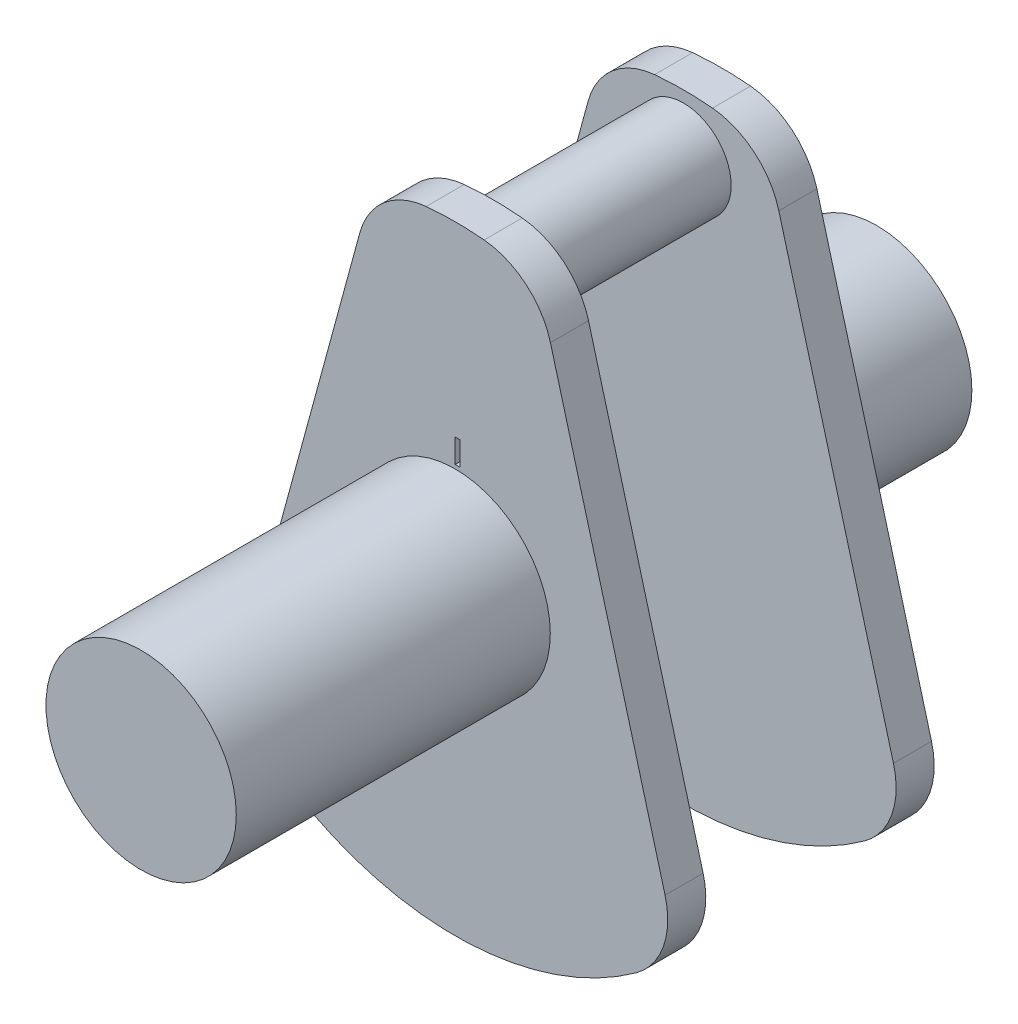
ISO-10303-21;
HEADER;
FILE_DESCRIPTION(('STEP AP214'),'2;1');
FILE_NAME('part.step','',(''),(''),'','','');
FILE_SCHEMA(('AUTOMOTIVE_DESIGN { 1 0 10303 214 1 1 1 1 }'));
ENDSEC;
DATA;
#1=APPLICATION_CONTEXT('core data for automotive mechanical design processes');
#2=APPLICATION_PROTOCOL_DEFINITION('international standard','automotive_design',2000,#1);
#3=PRODUCT_CONTEXT('',#1,'mechanical');
#4=PRODUCT('Part','Part','',(#3));
#5=PRODUCT_RELATED_PRODUCT_CATEGORY('part','',(#4));
#6=PRODUCT_DEFINITION_FORMATION('','',#4);
#7=PRODUCT_DEFINITION_CONTEXT('part definition',#1,'design');
#8=PRODUCT_DEFINITION('design','',#6,#7);
#9=PRODUCT_DEFINITION_SHAPE('','',#8);
#10=(LENGTH_UNIT() NAMED_UNIT(*) SI_UNIT(.MILLI.,.METRE.));
#11=(NAMED_UNIT(*) PLANE_ANGLE_UNIT() SI_UNIT($,.RADIAN.));
#12=(NAMED_UNIT(*) SI_UNIT($,.STERADIAN.) SOLID_ANGLE_UNIT());
#13=UNCERTAINTY_MEASURE_WITH_UNIT(LENGTH_MEASURE(1.E-05),#10,'distance_accuracy_value','');
#14=(GEOMETRIC_REPRESENTATION_CONTEXT(3) GLOBAL_UNCERTAINTY_ASSIGNED_CONTEXT((#13)) GLOBAL_UNIT_ASSIGNED_CONTEXT((#10,
#11,#12)) REPRESENTATION_CONTEXT('',''));
#15=CARTESIAN_POINT('',(0.,0.,0.));
#16=DIRECTION('',(0.,0.,1.));
#17=DIRECTION('',(1.,0.,0.));
#18=AXIS2_PLACEMENT_3D('',#15,#16,#17);
#19=CARTESIAN_POINT('',(0.459,4.87845457086565,0.8));
#20=DIRECTION('',(0.,0.,-1.));
#21=DIRECTION('',(-1.,0.,0.));
#22=AXIS2_PLACEMENT_3D('',#19,#20,#21);
#23=CYLINDRICAL_SURFACE('',#22,1.6);
#24=CARTESIAN_POINT('',(0.459,4.87845457086565,0.));
#25=DIRECTION('',(0.,0.,1.));
#26=DIRECTION('',(1.,0.,0.));
#27=AXIS2_PLACEMENT_3D('',#24,#25,#26);
#28=CIRCLE('',#27,1.6);
#29=CARTESIAN_POINT('',(2.00284320160388,5.29863092534255,0.));
#30=VERTEX_POINT('',#29);
#31=CARTESIAN_POINT('',(0.608877551020407,6.47141932869934,0.));
#32=VERTEX_POINT('',#31);
#33=EDGE_CURVE('E148',#30,#32,#28,.T.);
#34=ORIENTED_EDGE('',*,*,#33,.T.);
#35=DIRECTION('',(0.,0.,-1.));
#36=VECTOR('',#35,1.);
#37=CARTESIAN_POINT('',(0.608877551020407,6.47141932869934,0.8));
#38=LINE('',#37,#36);
#39=CARTESIAN_POINT('',(0.608877551020407,6.47141932869934,0.8));
#40=VERTEX_POINT('',#39);
#41=EDGE_CURVE('E46',#40,#32,#38,.T.);
#42=ORIENTED_EDGE('',*,*,#41,.F.);
#43=CARTESIAN_POINT('',(0.459,4.87845457086565,0.8));
#44=DIRECTION('',(0.,0.,1.));
#45=DIRECTION('',(1.,0.,0.));
#46=AXIS2_PLACEMENT_3D('',#43,#44,#45);
#47=CIRCLE('',#46,1.6);
#48=CARTESIAN_POINT('',(2.00284320160388,5.29863092534255,0.8));
#49=VERTEX_POINT('',#48);
#50=EDGE_CURVE('E164',#49,#40,#47,.T.);
#51=ORIENTED_EDGE('',*,*,#50,.F.);
#52=DIRECTION('',(0.,0.,-1.));
#53=VECTOR('',#52,1.);
#54=CARTESIAN_POINT('',(2.00284320160388,5.29863092534255,0.8));
#55=LINE('',#54,#53);
#56=EDGE_CURVE('E144',#49,#30,#55,.T.);
#57=ORIENTED_EDGE('',*,*,#56,.T.);
#58=EDGE_LOOP('',(#34,#42,#51,#57));
#59=FACE_BOUND('',#58,.T.);
#60=ADVANCED_FACE('F39',(#59),#23,.T.);
#61=CARTESIAN_POINT('',(0.,0.,0.8));
#62=DIRECTION('',(0.,0.,-1.));
#63=DIRECTION('',(-1.,0.,0.));
#64=AXIS2_PLACEMENT_3D('',#61,#62,#63);
#65=CYLINDRICAL_SURFACE('',#64,6.5);
#66=CARTESIAN_POINT('',(0.,0.,0.));
#67=DIRECTION('',(0.,0.,1.));
#68=DIRECTION('',(1.,0.,0.));
#69=AXIS2_PLACEMENT_3D('',#66,#67,#68);
#70=CIRCLE('',#69,6.5);
#71=CARTESIAN_POINT('',(-0.608877551020408,6.47141932869934,0.));
#72=VERTEX_POINT('',#71);
#73=EDGE_CURVE('E151',#32,#72,#70,.T.);
#74=ORIENTED_EDGE('',*,*,#73,.T.);
#75=DIRECTION('',(0.,0.,-1.));
#76=VECTOR('',#75,1.);
#77=CARTESIAN_POINT('',(-0.608877551020408,6.47141932869934,0.8));
#78=LINE('',#77,#76);
#79=CARTESIAN_POINT('',(-0.608877551020408,6.47141932869934,0.8));
#80=VERTEX_POINT('',#79);
#81=EDGE_CURVE('E174',#80,#72,#78,.T.);
#82=ORIENTED_EDGE('',*,*,#81,.F.);
#83=CARTESIAN_POINT('',(0.,0.,0.8));
#84=DIRECTION('',(0.,0.,1.));
#85=DIRECTION('',(1.,0.,0.));
#86=AXIS2_PLACEMENT_3D('',#83,#84,#85);
#87=CIRCLE('',#86,6.5);
#88=EDGE_CURVE('E104',#40,#80,#87,.T.);
#89=ORIENTED_EDGE('',*,*,#88,.F.);
#90=ORIENTED_EDGE('',*,*,#41,.T.);
#91=EDGE_LOOP('',(#74,#82,#89,#90));
#92=FACE_BOUND('',#91,.T.);
#93=ADVANCED_FACE('F177',(#92),#65,.T.);
#94=CARTESIAN_POINT('',(-0.459,4.87845457086565,0.8));
#95=DIRECTION('',(0.,0.,-1.));
#96=DIRECTION('',(-1.,0.,0.));
#97=AXIS2_PLACEMENT_3D('',#94,#95,#96);
#98=CYLINDRICAL_SURFACE('',#97,1.6);
#99=CARTESIAN_POINT('',(-0.459,4.87845457086565,0.));
#100=DIRECTION('',(0.,0.,1.));
#101=DIRECTION('',(1.,0.,0.));
#102=AXIS2_PLACEMENT_3D('',#99,#100,#101);
#103=CIRCLE('',#102,1.6);
#104=CARTESIAN_POINT('',(-2.00284320160388,5.29863092534255,0.));
#105=VERTEX_POINT('',#104);
#106=EDGE_CURVE('E154',#72,#105,#103,.T.);
#107=ORIENTED_EDGE('',*,*,#106,.T.);
#108=DIRECTION('',(0.,0.,-1.));
#109=VECTOR('',#108,1.);
#110=CARTESIAN_POINT('',(-2.00284320160388,5.29863092534255,0.8));
#111=LINE('',#110,#109);
#112=CARTESIAN_POINT('',(-2.00284320160388,5.29863092534255,0.8));
#113=VERTEX_POINT('',#112);
#114=EDGE_CURVE('E171',#113,#105,#111,.T.);
#115=ORIENTED_EDGE('',*,*,#114,.F.);
#116=CARTESIAN_POINT('',(-0.459,4.87845457086565,0.8));
#117=DIRECTION('',(0.,0.,1.));
#118=DIRECTION('',(1.,0.,0.));
#119=AXIS2_PLACEMENT_3D('',#116,#117,#118);
#120=CIRCLE('',#119,1.6);
#121=EDGE_CURVE('E195',#80,#113,#120,.T.);
#122=ORIENTED_EDGE('',*,*,#121,.F.);
#123=ORIENTED_EDGE('',*,*,#81,.T.);
#124=EDGE_LOOP('',(#107,#115,#122,#123));
#125=FACE_BOUND('',#124,.T.);
#126=ADVANCED_FACE('F188',(#125),#98,.T.);
#127=CARTESIAN_POINT('',(-2.00284320160388,5.29863092534255,0.8));
#128=DIRECTION('',(0.964902001002423,-0.26261022154806,0.));
#129=DIRECTION('',(0.26261022154806,0.964902001002423,0.));
#130=AXIS2_PLACEMENT_3D('',#127,#128,#129);
#131=PLANE('',#130);
#132=DIRECTION('',(-0.26261022154806,-0.964902001002422,0.));
#133=VECTOR('',#132,1.);
#134=CARTESIAN_POINT('',(-2.00284320160388,5.29863092534255,0.));
#135=LINE('',#134,#133);
#136=CARTESIAN_POINT('',(-4.41186786120333,-3.55278658921254,0.));
#137=VERTEX_POINT('',#136);
#138=EDGE_CURVE('E156',#105,#137,#135,.T.);
#139=ORIENTED_EDGE('',*,*,#138,.T.);
#140=DIRECTION('',(0.,0.,-1.));
#141=VECTOR('',#140,1.);
#142=CARTESIAN_POINT('',(-4.41186786120333,-3.55278658921254,0.8));
#143=LINE('',#142,#141);
#144=CARTESIAN_POINT('',(-4.41186786120333,-3.55278658921254,0.8));
#145=VERTEX_POINT('',#144);
#146=EDGE_CURVE('E168',#145,#137,#143,.T.);
#147=ORIENTED_EDGE('',*,*,#146,.F.);
#148=DIRECTION('',(-0.26261022154806,-0.964902001002422,0.));
#149=VECTOR('',#148,1.);
#150=CARTESIAN_POINT('',(-2.00284320160388,5.29863092534255,0.8));
#151=LINE('',#150,#149);
#152=EDGE_CURVE('E194',#113,#145,#151,.T.);
#153=ORIENTED_EDGE('',*,*,#152,.F.);
#154=ORIENTED_EDGE('',*,*,#114,.T.);
#155=EDGE_LOOP('',(#139,#147,#153,#154));
#156=FACE_BOUND('',#155,.T.);
#157=ADVANCED_FACE('F192',(#156),#131,.F.);
#158=CARTESIAN_POINT('',(-2.86802465959945,-3.97296294368944,0.8));
#159=DIRECTION('',(0.,0.,-1.));
#160=DIRECTION('',(-1.,0.,0.));
#161=AXIS2_PLACEMENT_3D('',#158,#159,#160);
#162=CYLINDRICAL_SURFACE('',#161,1.6);
#163=CARTESIAN_POINT('',(-2.86802465959945,-3.97296294368944,0.));
#164=DIRECTION('',(0.,0.,1.));
#165=DIRECTION('',(-1.,0.,0.));
#166=AXIS2_PLACEMENT_3D('',#163,#164,#165);
#167=CIRCLE('',#166,1.6);
#168=CARTESIAN_POINT('',(-3.80452250763193,-5.27025696611864,0.));
#169=VERTEX_POINT('',#168);
#170=EDGE_CURVE('E158',#137,#169,#167,.T.);
#171=ORIENTED_EDGE('',*,*,#170,.T.);
#172=DIRECTION('',(0.,0.,-1.));
#173=VECTOR('',#172,1.);
#174=CARTESIAN_POINT('',(-3.80452250763193,-5.27025696611864,0.8));
#175=LINE('',#174,#173);
#176=CARTESIAN_POINT('',(-3.80452250763193,-5.27025696611864,0.8));
#177=VERTEX_POINT('',#176);
#178=EDGE_CURVE('E139',#177,#169,#175,.T.);
#179=ORIENTED_EDGE('',*,*,#178,.F.);
#180=CARTESIAN_POINT('',(-2.86802465959945,-3.97296294368944,0.8));
#181=DIRECTION('',(0.,0.,1.));
#182=DIRECTION('',(-1.,0.,0.));
#183=AXIS2_PLACEMENT_3D('',#180,#181,#182);
#184=CIRCLE('',#183,1.6);
#185=EDGE_CURVE('E127',#145,#177,#184,.T.);
#186=ORIENTED_EDGE('',*,*,#185,.F.);
#187=ORIENTED_EDGE('',*,*,#146,.T.);
#188=EDGE_LOOP('',(#171,#179,#186,#187));
#189=FACE_BOUND('',#188,.T.);
#190=ADVANCED_FACE('F437',(#189),#162,.T.);
#191=CARTESIAN_POINT('',(0.,0.,0.8));
#192=DIRECTION('',(0.,0.,-1.));
#193=DIRECTION('',(-1.,0.,0.));
#194=AXIS2_PLACEMENT_3D('',#191,#192,#193);
#195=CYLINDRICAL_SURFACE('',#194,6.5);
#196=CARTESIAN_POINT('',(0.,0.,0.));
#197=DIRECTION('',(0.,0.,1.));
#198=DIRECTION('',(1.,0.,0.));
#199=AXIS2_PLACEMENT_3D('',#196,#197,#198);
#200=CIRCLE('',#199,6.5);
#201=CARTESIAN_POINT('',(3.80452250763193,-5.27025696611864,0.));
#202=VERTEX_POINT('',#201);
#203=EDGE_CURVE('E136',#169,#202,#200,.T.);
#204=ORIENTED_EDGE('',*,*,#203,.T.);
#205=DIRECTION('',(0.,0.,-1.));
#206=VECTOR('',#205,1.);
#207=CARTESIAN_POINT('',(3.80452250763193,-5.27025696611864,0.8));
#208=LINE('',#207,#206);
#209=CARTESIAN_POINT('',(3.80452250763193,-5.27025696611864,0.8));
#210=VERTEX_POINT('',#209);
#211=EDGE_CURVE('E133',#210,#202,#208,.T.);
#212=ORIENTED_EDGE('',*,*,#211,.F.);
#213=CARTESIAN_POINT('',(0.,0.,0.8));
#214=DIRECTION('',(0.,0.,1.));
#215=DIRECTION('',(1.,0.,0.));
#216=AXIS2_PLACEMENT_3D('',#213,#214,#215);
#217=CIRCLE('',#216,6.5);
#218=EDGE_CURVE('E120',#177,#210,#217,.T.);
#219=ORIENTED_EDGE('',*,*,#218,.F.);
#220=ORIENTED_EDGE('',*,*,#178,.T.);
#221=EDGE_LOOP('',(#204,#212,#219,#220));
#222=FACE_BOUND('',#221,.T.);
#223=ADVANCED_FACE('F134',(#222),#195,.T.);
#224=CARTESIAN_POINT('',(2.86802465959945,-3.97296294368944,0.8));
#225=DIRECTION('',(0.,0.,-1.));
#226=DIRECTION('',(-1.,0.,0.));
#227=AXIS2_PLACEMENT_3D('',#224,#225,#226);
#228=CYLINDRICAL_SURFACE('',#227,1.6);
#229=CARTESIAN_POINT('',(2.86802465959945,-3.97296294368944,0.));
#230=DIRECTION('',(0.,0.,1.));
#231=DIRECTION('',(1.,0.,0.));
#232=AXIS2_PLACEMENT_3D('',#229,#230,#231);
#233=CIRCLE('',#232,1.6);
#234=CARTESIAN_POINT('',(4.41186786120333,-3.55278658921254,0.));
#235=VERTEX_POINT('',#234);
#236=EDGE_CURVE('E161',#202,#235,#233,.T.);
#237=ORIENTED_EDGE('',*,*,#236,.T.);
#238=DIRECTION('',(0.,0.,-1.));
#239=VECTOR('',#238,1.);
#240=CARTESIAN_POINT('',(4.41186786120333,-3.55278658921254,0.8));
#241=LINE('',#240,#239);
#242=CARTESIAN_POINT('',(4.41186786120333,-3.55278658921254,0.8));
#243=VERTEX_POINT('',#242);
#244=EDGE_CURVE('E140',#243,#235,#241,.T.);
#245=ORIENTED_EDGE('',*,*,#244,.F.);
#246=CARTESIAN_POINT('',(2.86802465959945,-3.97296294368944,0.8));
#247=DIRECTION('',(0.,0.,1.));
#248=DIRECTION('',(1.,0.,0.));
#249=AXIS2_PLACEMENT_3D('',#246,#247,#248);
#250=CIRCLE('',#249,1.6);
#251=EDGE_CURVE('E124',#210,#243,#250,.T.);
#252=ORIENTED_EDGE('',*,*,#251,.F.);
#253=ORIENTED_EDGE('',*,*,#211,.T.);
#254=EDGE_LOOP('',(#237,#245,#252,#253));
#255=FACE_BOUND('',#254,.T.);
#256=ADVANCED_FACE('F142',(#255),#228,.T.);
#257=CARTESIAN_POINT('',(2.00284320160388,5.29863092534255,0.8));
#258=DIRECTION('',(-0.964902001002423,-0.26261022154806,0.));
#259=DIRECTION('',(0.26261022154806,-0.964902001002423,0.));
#260=AXIS2_PLACEMENT_3D('',#257,#258,#259);
#261=PLANE('',#260);
#262=DIRECTION('',(-0.26261022154806,0.964902001002422,0.));
#263=VECTOR('',#262,1.);
#264=CARTESIAN_POINT('',(2.00284320160388,5.29863092534255,0.));
#265=LINE('',#264,#263);
#266=EDGE_CURVE('E95',#235,#30,#265,.T.);
#267=ORIENTED_EDGE('',*,*,#266,.T.);
#268=ORIENTED_EDGE('',*,*,#56,.F.);
#269=DIRECTION('',(-0.26261022154806,0.964902001002422,0.));
#270=VECTOR('',#269,1.);
#271=CARTESIAN_POINT('',(2.00284320160388,5.29863092534255,0.8));
#272=LINE('',#271,#270);
#273=EDGE_CURVE('E62',#243,#49,#272,.T.);
#274=ORIENTED_EDGE('',*,*,#273,.F.);
#275=ORIENTED_EDGE('',*,*,#244,.T.);
#276=EDGE_LOOP('',(#267,#268,#274,#275));
#277=FACE_BOUND('',#276,.T.);
#278=ADVANCED_FACE('F445',(#277),#261,.F.);
#279=CARTESIAN_POINT('',(0.459,4.87845457086565,0.8));
#280=DIRECTION('',(0.,0.,1.));
#281=DIRECTION('',(1.,0.,0.));
#282=AXIS2_PLACEMENT_3D('',#279,#280,#281);
#283=PLANE('',#282);
#284=CARTESIAN_POINT('',(0.,5.259,0.8));
#285=DIRECTION('',(0.,0.,1.));
#286=DIRECTION('',(1.,0.,0.));
#287=AXIS2_PLACEMENT_3D('',#284,#285,#286);
#288=CIRCLE('',#287,1.);
#289=CARTESIAN_POINT('',(1.,5.259,0.8));
#290=VERTEX_POINT('',#289);
#291=EDGE_CURVE('E152',#290,#290,#288,.T.);
#292=ORIENTED_EDGE('',*,*,#291,.F.);
#293=EDGE_LOOP('',(#292));
#294=FACE_BOUND('',#293,.T.);
#295=ORIENTED_EDGE('',*,*,#50,.T.);
#296=ORIENTED_EDGE('',*,*,#88,.T.);
#297=ORIENTED_EDGE('',*,*,#121,.T.);
#298=ORIENTED_EDGE('',*,*,#152,.T.);
#299=ORIENTED_EDGE('',*,*,#185,.T.);
#300=ORIENTED_EDGE('',*,*,#218,.T.);
#301=ORIENTED_EDGE('',*,*,#251,.T.);
#302=ORIENTED_EDGE('',*,*,#273,.T.);
#303=EDGE_LOOP('',(#295,#296,#297,#298,#299,#300,#301,#302));
#304=FACE_BOUND('',#303,.T.);
#305=ADVANCED_FACE('F122',(#294,#304),#283,.T.);
#306=CARTESIAN_POINT('',(0.459,4.87845457086565,0.));
#307=DIRECTION('',(0.,0.,1.));
#308=DIRECTION('',(1.,0.,0.));
#309=AXIS2_PLACEMENT_3D('',#306,#307,#308);
#310=PLANE('',#309);
#311=CARTESIAN_POINT('',(0.,0.,0.));
#312=DIRECTION('',(0.,0.,1.));
#313=DIRECTION('',(1.,0.,0.));
#314=AXIS2_PLACEMENT_3D('',#311,#312,#313);
#315=CIRCLE('',#314,2.);
#316=CARTESIAN_POINT('',(2.,0.,0.));
#317=VERTEX_POINT('',#316);
#318=EDGE_CURVE('E11',#317,#317,#315,.F.);
#319=ORIENTED_EDGE('',*,*,#318,.F.);
#320=EDGE_LOOP('',(#319));
#321=FACE_BOUND('',#320,.T.);
#322=ORIENTED_EDGE('',*,*,#33,.F.);
#323=ORIENTED_EDGE('',*,*,#266,.F.);
#324=ORIENTED_EDGE('',*,*,#236,.F.);
#325=ORIENTED_EDGE('',*,*,#203,.F.);
#326=ORIENTED_EDGE('',*,*,#170,.F.);
#327=ORIENTED_EDGE('',*,*,#138,.F.);
#328=ORIENTED_EDGE('',*,*,#106,.F.);
#329=ORIENTED_EDGE('',*,*,#73,.F.);
#330=EDGE_LOOP('',(#322,#323,#324,#325,#326,#327,#328,#329));
#331=FACE_BOUND('',#330,.T.);
#332=ADVANCED_FACE('F182',(#321,#331),#310,.F.);
#333=CARTESIAN_POINT('',(0.,5.259,2.8));
#334=DIRECTION('',(0.,0.,-1.));
#335=DIRECTION('',(-1.,0.,0.));
#336=AXIS2_PLACEMENT_3D('',#333,#334,#335);
#337=CYLINDRICAL_SURFACE('',#336,1.);
#338=ORIENTED_EDGE('',*,*,#291,.T.);
#339=EDGE_LOOP('',(#338));
#340=FACE_BOUND('',#339,.T.);
#341=CARTESIAN_POINT('',(0.,5.259,4.8));
#342=DIRECTION('',(0.,0.,1.));
#343=DIRECTION('',(1.,0.,0.));
#344=AXIS2_PLACEMENT_3D('',#341,#342,#343);
#345=CIRCLE('',#344,1.);
#346=CARTESIAN_POINT('',(1.,5.259,4.8));
#347=VERTEX_POINT('',#346);
#348=EDGE_CURVE('E259',#347,#347,#345,.T.);
#349=ORIENTED_EDGE('',*,*,#348,.F.);
#350=EDGE_LOOP('',(#349));
#351=FACE_BOUND('',#350,.T.);
#352=ADVANCED_FACE('F450',(#340,#351),#337,.T.);
#353=CARTESIAN_POINT('',(0.,0.,-3.26));
#354=DIRECTION('',(0.,0.,1.));
#355=DIRECTION('',(1.,0.,0.));
#356=AXIS2_PLACEMENT_3D('',#353,#354,#355);
#357=CYLINDRICAL_SURFACE('',#356,2.);
#358=CARTESIAN_POINT('',(0.,0.,-3.26));
#359=DIRECTION('',(0.,0.,-1.));
#360=DIRECTION('',(-1.,0.,0.));
#361=AXIS2_PLACEMENT_3D('',#358,#359,#360);
#362=CIRCLE('',#361,2.);
#363=CARTESIAN_POINT('',(-2.,0.,-3.26));
#364=VERTEX_POINT('',#363);
#365=EDGE_CURVE('E203',#364,#364,#362,.T.);
#366=ORIENTED_EDGE('',*,*,#365,.F.);
#367=EDGE_LOOP('',(#366));
#368=FACE_BOUND('',#367,.T.);
#369=ORIENTED_EDGE('',*,*,#318,.T.);
#370=EDGE_LOOP('',(#369));
#371=FACE_BOUND('',#370,.T.);
#372=ADVANCED_FACE('F457',(#368,#371),#357,.T.);
#373=CARTESIAN_POINT('',(0.,0.,-3.26));
#374=DIRECTION('',(0.,0.,-1.));
#375=DIRECTION('',(-1.,0.,0.));
#376=AXIS2_PLACEMENT_3D('',#373,#374,#375);
#377=PLANE('',#376);
#378=ORIENTED_EDGE('',*,*,#365,.T.);
#379=EDGE_LOOP('',(#378));
#380=FACE_BOUND('',#379,.T.);
#381=ADVANCED_FACE('F461',(#380),#377,.T.);
#382=CARTESIAN_POINT('',(0.459,4.87845457086565,4.8));
#383=DIRECTION('',(0.,0.,1.));
#384=DIRECTION('',(-1.,0.,0.));
#385=AXIS2_PLACEMENT_3D('',#382,#383,#384);
#386=CYLINDRICAL_SURFACE('',#385,1.6);
#387=CARTESIAN_POINT('',(0.459,4.87845457086565,5.6));
#388=DIRECTION('',(0.,0.,1.));
#389=DIRECTION('',(1.,0.,0.));
#390=AXIS2_PLACEMENT_3D('',#387,#388,#389);
#391=CIRCLE('',#390,1.6);
#392=CARTESIAN_POINT('',(2.00284320160388,5.29863092534255,5.6));
#393=VERTEX_POINT('',#392);
#394=CARTESIAN_POINT('',(0.608877551020407,6.47141932869934,5.6));
#395=VERTEX_POINT('',#394);
#396=EDGE_CURVE('E256',#393,#395,#391,.T.);
#397=ORIENTED_EDGE('',*,*,#396,.F.);
#398=DIRECTION('',(0.,0.,1.));
#399=VECTOR('',#398,1.);
#400=CARTESIAN_POINT('',(2.00284320160388,5.29863092534255,4.8));
#401=LINE('',#400,#399);
#402=CARTESIAN_POINT('',(2.00284320160388,5.29863092534255,4.8));
#403=VERTEX_POINT('',#402);
#404=EDGE_CURVE('E230',#403,#393,#401,.T.);
#405=ORIENTED_EDGE('',*,*,#404,.F.);
#406=CARTESIAN_POINT('',(0.459,4.87845457086565,4.8));
#407=DIRECTION('',(0.,0.,1.));
#408=DIRECTION('',(1.,0.,0.));
#409=AXIS2_PLACEMENT_3D('',#406,#407,#408);
#410=CIRCLE('',#409,1.6);
#411=CARTESIAN_POINT('',(0.608877551020407,6.47141932869934,4.8));
#412=VERTEX_POINT('',#411);
#413=EDGE_CURVE('E237',#403,#412,#410,.T.);
#414=ORIENTED_EDGE('',*,*,#413,.T.);
#415=DIRECTION('',(0.,0.,1.));
#416=VECTOR('',#415,1.);
#417=CARTESIAN_POINT('',(0.608877551020407,6.47141932869934,4.8));
#418=LINE('',#417,#416);
#419=EDGE_CURVE('E209',#412,#395,#418,.T.);
#420=ORIENTED_EDGE('',*,*,#419,.T.);
#421=EDGE_LOOP('',(#397,#405,#414,#420));
#422=FACE_BOUND('',#421,.T.);
#423=ADVANCED_FACE('F392',(#422),#386,.T.);
#424=CARTESIAN_POINT('',(0.,0.,4.8));
#425=DIRECTION('',(0.,0.,1.));
#426=DIRECTION('',(-1.,0.,0.));
#427=AXIS2_PLACEMENT_3D('',#424,#425,#426);
#428=CYLINDRICAL_SURFACE('',#427,6.5);
#429=CARTESIAN_POINT('',(0.,0.,5.6));
#430=DIRECTION('',(0.,0.,1.));
#431=DIRECTION('',(1.,0.,0.));
#432=AXIS2_PLACEMENT_3D('',#429,#430,#431);
#433=CIRCLE('',#432,6.5);
#434=CARTESIAN_POINT('',(-0.608877551020408,6.47141932869934,5.6));
#435=VERTEX_POINT('',#434);
#436=EDGE_CURVE('E253',#395,#435,#433,.T.);
#437=ORIENTED_EDGE('',*,*,#436,.F.);
#438=ORIENTED_EDGE('',*,*,#419,.F.);
#439=CARTESIAN_POINT('',(0.,0.,4.8));
#440=DIRECTION('',(0.,0.,1.));
#441=DIRECTION('',(1.,0.,0.));
#442=AXIS2_PLACEMENT_3D('',#439,#440,#441);
#443=CIRCLE('',#442,6.5);
#444=CARTESIAN_POINT('',(-0.608877551020408,6.47141932869934,4.8));
#445=VERTEX_POINT('',#444);
#446=EDGE_CURVE('E277',#412,#445,#443,.T.);
#447=ORIENTED_EDGE('',*,*,#446,.T.);
#448=DIRECTION('',(0.,0.,1.));
#449=VECTOR('',#448,1.);
#450=CARTESIAN_POINT('',(-0.608877551020408,6.47141932869934,4.8));
#451=LINE('',#450,#449);
#452=EDGE_CURVE('E212',#445,#435,#451,.T.);
#453=ORIENTED_EDGE('',*,*,#452,.T.);
#454=EDGE_LOOP('',(#437,#438,#447,#453));
#455=FACE_BOUND('',#454,.T.);
#456=ADVANCED_FACE('F395',(#455),#428,.T.);
#457=CARTESIAN_POINT('',(-0.459,4.87845457086565,4.8));
#458=DIRECTION('',(0.,0.,1.));
#459=DIRECTION('',(-1.,0.,0.));
#460=AXIS2_PLACEMENT_3D('',#457,#458,#459);
#461=CYLINDRICAL_SURFACE('',#460,1.6);
#462=CARTESIAN_POINT('',(-0.459,4.87845457086565,5.6));
#463=DIRECTION('',(0.,0.,1.));
#464=DIRECTION('',(1.,0.,0.));
#465=AXIS2_PLACEMENT_3D('',#462,#463,#464);
#466=CIRCLE('',#465,1.6);
#467=CARTESIAN_POINT('',(-2.00284320160388,5.29863092534255,5.6));
#468=VERTEX_POINT('',#467);
#469=EDGE_CURVE('E250',#435,#468,#466,.T.);
#470=ORIENTED_EDGE('',*,*,#469,.F.);
#471=ORIENTED_EDGE('',*,*,#452,.F.);
#472=CARTESIAN_POINT('',(-0.459,4.87845457086565,4.8));
#473=DIRECTION('',(0.,0.,1.));
#474=DIRECTION('',(1.,0.,0.));
#475=AXIS2_PLACEMENT_3D('',#472,#473,#474);
#476=CIRCLE('',#475,1.6);
#477=CARTESIAN_POINT('',(-2.00284320160388,5.29863092534255,4.8));
#478=VERTEX_POINT('',#477);
#479=EDGE_CURVE('E274',#445,#478,#476,.T.);
#480=ORIENTED_EDGE('',*,*,#479,.T.);
#481=DIRECTION('',(0.,0.,1.));
#482=VECTOR('',#481,1.);
#483=CARTESIAN_POINT('',(-2.00284320160388,5.29863092534255,4.8));
#484=LINE('',#483,#482);
#485=EDGE_CURVE('E215',#478,#468,#484,.T.);
#486=ORIENTED_EDGE('',*,*,#485,.T.);
#487=EDGE_LOOP('',(#470,#471,#480,#486));
#488=FACE_BOUND('',#487,.T.);
#489=ADVANCED_FACE('F398',(#488),#461,.T.);
#490=CARTESIAN_POINT('',(-2.00284320160388,5.29863092534255,4.8));
#491=DIRECTION('',(0.964902001002423,-0.26261022154806,0.));
#492=DIRECTION('',(0.26261022154806,0.964902001002423,0.));
#493=AXIS2_PLACEMENT_3D('',#490,#491,#492);
#494=PLANE('',#493);
#495=DIRECTION('',(-0.26261022154806,-0.964902001002422,0.));
#496=VECTOR('',#495,1.);
#497=CARTESIAN_POINT('',(-2.00284320160388,5.29863092534255,5.6));
#498=LINE('',#497,#496);
#499=CARTESIAN_POINT('',(-4.41186786120333,-3.55278658921254,5.6));
#500=VERTEX_POINT('',#499);
#501=EDGE_CURVE('E247',#468,#500,#498,.T.);
#502=ORIENTED_EDGE('',*,*,#501,.F.);
#503=ORIENTED_EDGE('',*,*,#485,.F.);
#504=DIRECTION('',(-0.26261022154806,-0.964902001002422,0.));
#505=VECTOR('',#504,1.);
#506=CARTESIAN_POINT('',(-2.00284320160388,5.29863092534255,4.8));
#507=LINE('',#506,#505);
#508=CARTESIAN_POINT('',(-4.41186786120333,-3.55278658921254,4.8));
#509=VERTEX_POINT('',#508);
#510=EDGE_CURVE('E271',#478,#509,#507,.T.);
#511=ORIENTED_EDGE('',*,*,#510,.T.);
#512=DIRECTION('',(0.,0.,1.));
#513=VECTOR('',#512,1.);
#514=CARTESIAN_POINT('',(-4.41186786120333,-3.55278658921254,4.8));
#515=LINE('',#514,#513);
#516=EDGE_CURVE('E218',#509,#500,#515,.T.);
#517=ORIENTED_EDGE('',*,*,#516,.T.);
#518=EDGE_LOOP('',(#502,#503,#511,#517));
#519=FACE_BOUND('',#518,.T.);
#520=ADVANCED_FACE('F401',(#519),#494,.F.);
#521=CARTESIAN_POINT('',(-2.86802465959945,-3.97296294368944,4.8));
#522=DIRECTION('',(0.,0.,1.));
#523=DIRECTION('',(-1.,0.,0.));
#524=AXIS2_PLACEMENT_3D('',#521,#522,#523);
#525=CYLINDRICAL_SURFACE('',#524,1.6);
#526=CARTESIAN_POINT('',(-2.86802465959945,-3.97296294368944,5.6));
#527=DIRECTION('',(0.,0.,1.));
#528=DIRECTION('',(-1.,0.,0.));
#529=AXIS2_PLACEMENT_3D('',#526,#527,#528);
#530=CIRCLE('',#529,1.6);
#531=CARTESIAN_POINT('',(-3.80452250763193,-5.27025696611864,5.6));
#532=VERTEX_POINT('',#531);
#533=EDGE_CURVE('E244',#500,#532,#530,.T.);
#534=ORIENTED_EDGE('',*,*,#533,.F.);
#535=ORIENTED_EDGE('',*,*,#516,.F.);
#536=CARTESIAN_POINT('',(-2.86802465959945,-3.97296294368944,4.8));
#537=DIRECTION('',(0.,0.,1.));
#538=DIRECTION('',(-1.,0.,0.));
#539=AXIS2_PLACEMENT_3D('',#536,#537,#538);
#540=CIRCLE('',#539,1.6);
#541=CARTESIAN_POINT('',(-3.80452250763193,-5.27025696611864,4.8));
#542=VERTEX_POINT('',#541);
#543=EDGE_CURVE('E268',#509,#542,#540,.T.);
#544=ORIENTED_EDGE('',*,*,#543,.T.);
#545=DIRECTION('',(0.,0.,1.));
#546=VECTOR('',#545,1.);
#547=CARTESIAN_POINT('',(-3.80452250763193,-5.27025696611864,4.8));
#548=LINE('',#547,#546);
#549=EDGE_CURVE('E221',#542,#532,#548,.T.);
#550=ORIENTED_EDGE('',*,*,#549,.T.);
#551=EDGE_LOOP('',(#534,#535,#544,#550));
#552=FACE_BOUND('',#551,.T.);
#553=ADVANCED_FACE('F404',(#552),#525,.T.);
#554=CARTESIAN_POINT('',(0.,0.,4.8));
#555=DIRECTION('',(0.,0.,1.));
#556=DIRECTION('',(-1.,0.,0.));
#557=AXIS2_PLACEMENT_3D('',#554,#555,#556);
#558=CYLINDRICAL_SURFACE('',#557,6.5);
#559=CARTESIAN_POINT('',(0.,0.,5.6));
#560=DIRECTION('',(0.,0.,1.));
#561=DIRECTION('',(1.,0.,0.));
#562=AXIS2_PLACEMENT_3D('',#559,#560,#561);
#563=CIRCLE('',#562,6.5);
#564=CARTESIAN_POINT('',(3.80452250763193,-5.27025696611864,5.6));
#565=VERTEX_POINT('',#564);
#566=EDGE_CURVE('E241',#532,#565,#563,.T.);
#567=ORIENTED_EDGE('',*,*,#566,.F.);
#568=ORIENTED_EDGE('',*,*,#549,.F.);
#569=CARTESIAN_POINT('',(0.,0.,4.8));
#570=DIRECTION('',(0.,0.,1.));
#571=DIRECTION('',(1.,0.,0.));
#572=AXIS2_PLACEMENT_3D('',#569,#570,#571);
#573=CIRCLE('',#572,6.5);
#574=CARTESIAN_POINT('',(3.80452250763193,-5.27025696611864,4.8));
#575=VERTEX_POINT('',#574);
#576=EDGE_CURVE('E265',#542,#575,#573,.T.);
#577=ORIENTED_EDGE('',*,*,#576,.T.);
#578=DIRECTION('',(0.,0.,1.));
#579=VECTOR('',#578,1.);
#580=CARTESIAN_POINT('',(3.80452250763193,-5.27025696611864,4.8));
#581=LINE('',#580,#579);
#582=EDGE_CURVE('E224',#575,#565,#581,.T.);
#583=ORIENTED_EDGE('',*,*,#582,.T.);
#584=EDGE_LOOP('',(#567,#568,#577,#583));
#585=FACE_BOUND('',#584,.T.);
#586=ADVANCED_FACE('F407',(#585),#558,.T.);
#587=CARTESIAN_POINT('',(2.86802465959945,-3.97296294368944,4.8));
#588=DIRECTION('',(0.,0.,1.));
#589=DIRECTION('',(-1.,0.,0.));
#590=AXIS2_PLACEMENT_3D('',#587,#588,#589);
#591=CYLINDRICAL_SURFACE('',#590,1.6);
#592=CARTESIAN_POINT('',(2.86802465959945,-3.97296294368944,5.6));
#593=DIRECTION('',(0.,0.,1.));
#594=DIRECTION('',(1.,0.,0.));
#595=AXIS2_PLACEMENT_3D('',#592,#593,#594);
#596=CIRCLE('',#595,1.6);
#597=CARTESIAN_POINT('',(4.41186786120333,-3.55278658921254,5.6));
#598=VERTEX_POINT('',#597);
#599=EDGE_CURVE('E238',#565,#598,#596,.T.);
#600=ORIENTED_EDGE('',*,*,#599,.F.);
#601=ORIENTED_EDGE('',*,*,#582,.F.);
#602=CARTESIAN_POINT('',(2.86802465959945,-3.97296294368944,4.8));
#603=DIRECTION('',(0.,0.,1.));
#604=DIRECTION('',(1.,0.,0.));
#605=AXIS2_PLACEMENT_3D('',#602,#603,#604);
#606=CIRCLE('',#605,1.6);
#607=CARTESIAN_POINT('',(4.41186786120333,-3.55278658921254,4.8));
#608=VERTEX_POINT('',#607);
#609=EDGE_CURVE('E262',#575,#608,#606,.T.);
#610=ORIENTED_EDGE('',*,*,#609,.T.);
#611=DIRECTION('',(0.,0.,1.));
#612=VECTOR('',#611,1.);
#613=CARTESIAN_POINT('',(4.41186786120333,-3.55278658921254,4.8));
#614=LINE('',#613,#612);
#615=EDGE_CURVE('E227',#608,#598,#614,.T.);
#616=ORIENTED_EDGE('',*,*,#615,.T.);
#617=EDGE_LOOP('',(#600,#601,#610,#616));
#618=FACE_BOUND('',#617,.T.);
#619=ADVANCED_FACE('F410',(#618),#591,.T.);
#620=CARTESIAN_POINT('',(2.00284320160388,5.29863092534255,4.8));
#621=DIRECTION('',(-0.964902001002423,-0.26261022154806,0.));
#622=DIRECTION('',(0.26261022154806,-0.964902001002423,0.));
#623=AXIS2_PLACEMENT_3D('',#620,#621,#622);
#624=PLANE('',#623);
#625=DIRECTION('',(-0.26261022154806,0.964902001002422,0.));
#626=VECTOR('',#625,1.);
#627=CARTESIAN_POINT('',(2.00284320160388,5.29863092534255,5.6));
#628=LINE('',#627,#626);
#629=EDGE_CURVE('E234',#598,#393,#628,.T.);
#630=ORIENTED_EDGE('',*,*,#629,.F.);
#631=ORIENTED_EDGE('',*,*,#615,.F.);
#632=DIRECTION('',(-0.26261022154806,0.964902001002422,0.));
#633=VECTOR('',#632,1.);
#634=CARTESIAN_POINT('',(2.00284320160388,5.29863092534255,4.8));
#635=LINE('',#634,#633);
#636=EDGE_CURVE('E233',#608,#403,#635,.T.);
#637=ORIENTED_EDGE('',*,*,#636,.T.);
#638=ORIENTED_EDGE('',*,*,#404,.T.);
#639=EDGE_LOOP('',(#630,#631,#637,#638));
#640=FACE_BOUND('',#639,.T.);
#641=ADVANCED_FACE('F389',(#640),#624,.F.);
#642=CARTESIAN_POINT('',(0.459,4.87845457086565,4.8));
#643=DIRECTION('',(0.,0.,-1.));
#644=DIRECTION('',(1.,0.,0.));
#645=AXIS2_PLACEMENT_3D('',#642,#643,#644);
#646=PLANE('',#645);
#647=ORIENTED_EDGE('',*,*,#348,.T.);
#648=EDGE_LOOP('',(#647));
#649=FACE_BOUND('',#648,.T.);
#650=ORIENTED_EDGE('',*,*,#413,.F.);
#651=ORIENTED_EDGE('',*,*,#636,.F.);
#652=ORIENTED_EDGE('',*,*,#609,.F.);
#653=ORIENTED_EDGE('',*,*,#576,.F.);
#654=ORIENTED_EDGE('',*,*,#543,.F.);
#655=ORIENTED_EDGE('',*,*,#510,.F.);
#656=ORIENTED_EDGE('',*,*,#479,.F.);
#657=ORIENTED_EDGE('',*,*,#446,.F.);
#658=EDGE_LOOP('',(#650,#651,#652,#653,#654,#655,#656,#657));
#659=FACE_BOUND('',#658,.T.);
#660=ADVANCED_FACE('F412',(#649,#659),#646,.T.);
#661=CARTESIAN_POINT('',(0.459,4.87845457086565,5.6));
#662=DIRECTION('',(0.,0.,-1.));
#663=DIRECTION('',(1.,0.,0.));
#664=AXIS2_PLACEMENT_3D('',#661,#662,#663);
#665=PLANE('',#664);
#666=DIRECTION('',(1.,0.,0.));
#667=VECTOR('',#666,1.);
#668=CARTESIAN_POINT('',(0.,2.08003462484577,5.6));
#669=LINE('',#668,#667);
#670=CARTESIAN_POINT('',(0.,2.08003462484577,5.6));
#671=VERTEX_POINT('',#670);
#672=CARTESIAN_POINT('',(0.1,2.08003462484577,5.6));
#673=VERTEX_POINT('',#672);
#674=EDGE_CURVE('E305',#671,#673,#669,.T.);
#675=ORIENTED_EDGE('',*,*,#674,.F.);
#676=DIRECTION('',(0.,-1.,0.));
#677=VECTOR('',#676,1.);
#678=CARTESIAN_POINT('',(0.,2.08003462484577,5.6));
#679=LINE('',#678,#677);
#680=CARTESIAN_POINT('',(0.,2.58003462484577,5.6));
#681=VERTEX_POINT('',#680);
#682=EDGE_CURVE('E53',#681,#671,#679,.T.);
#683=ORIENTED_EDGE('',*,*,#682,.F.);
#684=DIRECTION('',(-1.,0.,0.));
#685=VECTOR('',#684,1.);
#686=CARTESIAN_POINT('',(0.,2.58003462484577,5.6));
#687=LINE('',#686,#685);
#688=CARTESIAN_POINT('',(0.1,2.58003462484577,5.6));
#689=VERTEX_POINT('',#688);
#690=EDGE_CURVE('E298',#689,#681,#687,.T.);
#691=ORIENTED_EDGE('',*,*,#690,.F.);
#692=DIRECTION('',(0.,1.,0.));
#693=VECTOR('',#692,1.);
#694=CARTESIAN_POINT('',(0.1,2.08003462484577,5.6));
#695=LINE('',#694,#693);
#696=EDGE_CURVE('E302',#673,#689,#695,.T.);
#697=ORIENTED_EDGE('',*,*,#696,.F.);
#698=EDGE_LOOP('',(#675,#683,#691,#697));
#699=FACE_BOUND('',#698,.T.);
#700=CARTESIAN_POINT('',(0.,0.,5.6));
#701=DIRECTION('',(0.,0.,1.));
#702=DIRECTION('',(1.,0.,0.));
#703=AXIS2_PLACEMENT_3D('',#700,#701,#702);
#704=CIRCLE('',#703,2.);
#705=CARTESIAN_POINT('',(2.,0.,5.6));
#706=VERTEX_POINT('',#705);
#707=EDGE_CURVE('E206',#706,#706,#704,.F.);
#708=ORIENTED_EDGE('',*,*,#707,.T.);
#709=EDGE_LOOP('',(#708));
#710=FACE_BOUND('',#709,.T.);
#711=ORIENTED_EDGE('',*,*,#396,.T.);
#712=ORIENTED_EDGE('',*,*,#436,.T.);
#713=ORIENTED_EDGE('',*,*,#469,.T.);
#714=ORIENTED_EDGE('',*,*,#501,.T.);
#715=ORIENTED_EDGE('',*,*,#533,.T.);
#716=ORIENTED_EDGE('',*,*,#566,.T.);
#717=ORIENTED_EDGE('',*,*,#599,.T.);
#718=ORIENTED_EDGE('',*,*,#629,.T.);
#719=EDGE_LOOP('',(#711,#712,#713,#714,#715,#716,#717,#718));
#720=FACE_BOUND('',#719,.T.);
#721=ADVANCED_FACE('F386',(#699,#710,#720),#665,.F.);
#722=CARTESIAN_POINT('',(0.,0.,8.86));
#723=DIRECTION('',(0.,0.,-1.));
#724=DIRECTION('',(1.,0.,0.));
#725=AXIS2_PLACEMENT_3D('',#722,#723,#724);
#726=CYLINDRICAL_SURFACE('',#725,2.);
#727=ORIENTED_EDGE('',*,*,#707,.F.);
#728=EDGE_LOOP('',(#727));
#729=FACE_BOUND('',#728,.T.);
#730=CARTESIAN_POINT('',(0.,0.,12.2));
#731=DIRECTION('',(0.,0.,1.));
#732=DIRECTION('',(1.,0.,0.));
#733=AXIS2_PLACEMENT_3D('',#730,#731,#732);
#734=CIRCLE('',#733,2.);
#735=CARTESIAN_POINT('',(2.,0.,12.2));
#736=VERTEX_POINT('',#735);
#737=EDGE_CURVE('E284',#736,#736,#734,.T.);
#738=ORIENTED_EDGE('',*,*,#737,.F.);
#739=EDGE_LOOP('',(#738));
#740=FACE_BOUND('',#739,.T.);
#741=ADVANCED_FACE('F421',(#729,#740),#726,.T.);
#742=CARTESIAN_POINT('',(0.,0.,12.2));
#743=DIRECTION('',(0.,0.,1.));
#744=DIRECTION('',(1.,0.,0.));
#745=AXIS2_PLACEMENT_3D('',#742,#743,#744);
#746=PLANE('',#745);
#747=ORIENTED_EDGE('',*,*,#737,.T.);
#748=EDGE_LOOP('',(#747));
#749=FACE_BOUND('',#748,.T.);
#750=ADVANCED_FACE('F501',(#749),#746,.T.);
#751=CARTESIAN_POINT('',(0.,2.08003462484577,5.5));
#752=DIRECTION('',(-1.,0.,0.));
#753=DIRECTION('',(0.,0.,1.));
#754=AXIS2_PLACEMENT_3D('',#751,#752,#753);
#755=PLANE('',#754);
#756=ORIENTED_EDGE('',*,*,#682,.T.);
#757=DIRECTION('',(0.,0.,1.));
#758=VECTOR('',#757,1.);
#759=CARTESIAN_POINT('',(0.,2.08003462484577,5.5));
#760=LINE('',#759,#758);
#761=CARTESIAN_POINT('',(0.,2.08003462484577,5.5));
#762=VERTEX_POINT('',#761);
#763=EDGE_CURVE('E288',#762,#671,#760,.T.);
#764=ORIENTED_EDGE('',*,*,#763,.F.);
#765=DIRECTION('',(0.,-1.,0.));
#766=VECTOR('',#765,1.);
#767=CARTESIAN_POINT('',(0.,2.08003462484577,5.5));
#768=LINE('',#767,#766);
#769=CARTESIAN_POINT('',(0.,2.58003462484577,5.5));
#770=VERTEX_POINT('',#769);
#771=EDGE_CURVE('E301',#770,#762,#768,.T.);
#772=ORIENTED_EDGE('',*,*,#771,.F.);
#773=DIRECTION('',(0.,0.,1.));
#774=VECTOR('',#773,1.);
#775=CARTESIAN_POINT('',(0.,2.58003462484577,5.5));
#776=LINE('',#775,#774);
#777=EDGE_CURVE('E287',#770,#681,#776,.T.);
#778=ORIENTED_EDGE('',*,*,#777,.T.);
#779=EDGE_LOOP('',(#756,#764,#772,#778));
#780=FACE_BOUND('',#779,.T.);
#781=ADVANCED_FACE('F328',(#780),#755,.F.);
#782=CARTESIAN_POINT('',(0.,2.58003462484577,5.5));
#783=DIRECTION('',(0.,1.,0.));
#784=DIRECTION('',(0.,0.,1.));
#785=AXIS2_PLACEMENT_3D('',#782,#783,#784);
#786=PLANE('',#785);
#787=ORIENTED_EDGE('',*,*,#690,.T.);
#788=ORIENTED_EDGE('',*,*,#777,.F.);
#789=DIRECTION('',(-1.,0.,0.));
#790=VECTOR('',#789,1.);
#791=CARTESIAN_POINT('',(0.,2.58003462484577,5.5));
#792=LINE('',#791,#790);
#793=CARTESIAN_POINT('',(0.1,2.58003462484577,5.5));
#794=VERTEX_POINT('',#793);
#795=EDGE_CURVE('E291',#794,#770,#792,.T.);
#796=ORIENTED_EDGE('',*,*,#795,.F.);
#797=DIRECTION('',(0.,0.,1.));
#798=VECTOR('',#797,1.);
#799=CARTESIAN_POINT('',(0.1,2.58003462484577,5.5));
#800=LINE('',#799,#798);
#801=EDGE_CURVE('E294',#794,#689,#800,.T.);
#802=ORIENTED_EDGE('',*,*,#801,.T.);
#803=EDGE_LOOP('',(#787,#788,#796,#802));
#804=FACE_BOUND('',#803,.T.);
#805=ADVANCED_FACE('F522',(#804),#786,.F.);
#806=CARTESIAN_POINT('',(0.1,2.08003462484577,5.5));
#807=DIRECTION('',(1.,0.,0.));
#808=DIRECTION('',(0.,0.,-1.));
#809=AXIS2_PLACEMENT_3D('',#806,#807,#808);
#810=PLANE('',#809);
#811=ORIENTED_EDGE('',*,*,#696,.T.);
#812=ORIENTED_EDGE('',*,*,#801,.F.);
#813=DIRECTION('',(0.,1.,0.));
#814=VECTOR('',#813,1.);
#815=CARTESIAN_POINT('',(0.1,2.08003462484577,5.5));
#816=LINE('',#815,#814);
#817=CARTESIAN_POINT('',(0.1,2.08003462484577,5.5));
#818=VERTEX_POINT('',#817);
#819=EDGE_CURVE('E311',#818,#794,#816,.T.);
#820=ORIENTED_EDGE('',*,*,#819,.F.);
#821=DIRECTION('',(0.,0.,1.));
#822=VECTOR('',#821,1.);
#823=CARTESIAN_POINT('',(0.1,2.08003462484577,5.5));
#824=LINE('',#823,#822);
#825=EDGE_CURVE('E290',#818,#673,#824,.T.);
#826=ORIENTED_EDGE('',*,*,#825,.T.);
#827=EDGE_LOOP('',(#811,#812,#820,#826));
#828=FACE_BOUND('',#827,.T.);
#829=ADVANCED_FACE('F531',(#828),#810,.F.);
#830=CARTESIAN_POINT('',(0.,2.08003462484577,5.5));
#831=DIRECTION('',(0.,-1.,0.));
#832=DIRECTION('',(0.,0.,-1.));
#833=AXIS2_PLACEMENT_3D('',#830,#831,#832);
#834=PLANE('',#833);
#835=ORIENTED_EDGE('',*,*,#674,.T.);
#836=ORIENTED_EDGE('',*,*,#825,.F.);
#837=DIRECTION('',(1.,0.,0.));
#838=VECTOR('',#837,1.);
#839=CARTESIAN_POINT('',(0.,2.08003462484577,5.5));
#840=LINE('',#839,#838);
#841=EDGE_CURVE('E314',#762,#818,#840,.T.);
#842=ORIENTED_EDGE('',*,*,#841,.F.);
#843=ORIENTED_EDGE('',*,*,#763,.T.);
#844=EDGE_LOOP('',(#835,#836,#842,#843));
#845=FACE_BOUND('',#844,.T.);
#846=ADVANCED_FACE('F540',(#845),#834,.F.);
#847=CARTESIAN_POINT('',(0.,0.,5.5));
#848=DIRECTION('',(0.,0.,-1.));
#849=DIRECTION('',(-1.,0.,0.));
#850=AXIS2_PLACEMENT_3D('',#847,#848,#849);
#851=PLANE('',#850);
#852=ORIENTED_EDGE('',*,*,#771,.T.);
#853=ORIENTED_EDGE('',*,*,#841,.T.);
#854=ORIENTED_EDGE('',*,*,#819,.T.);
#855=ORIENTED_EDGE('',*,*,#795,.T.);
#856=EDGE_LOOP('',(#852,#853,#854,#855));
#857=FACE_BOUND('',#856,.T.);
#858=ADVANCED_FACE('F321',(#857),#851,.F.);
#859=CLOSED_SHELL('',(#60,#93,#126,#157,#190,#223,#256,#278,#305,#332,#352,#372,#381,#423,#456,
#489,#520,#553,#586,#619,#641,#660,#721,#741,#750,#781,#805,#829,#846,#858));
#860=MANIFOLD_SOLID_BREP('B2',#859);
#861=ADVANCED_BREP_SHAPE_REPRESENTATION('',(#18,#860),#14);
#862=SHAPE_DEFINITION_REPRESENTATION(#9,#861);
ENDSEC;
END-ISO-10303-21;
